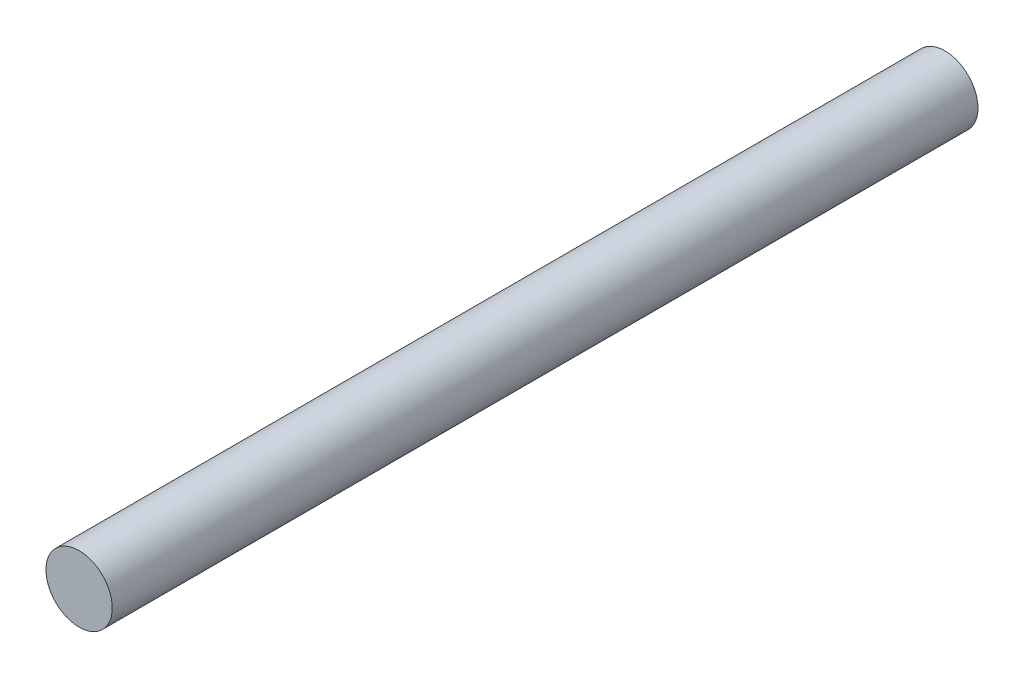
ISO-10303-21;
HEADER;
FILE_DESCRIPTION(('STEP AP214'),'2;1');
FILE_NAME('part.step','',(''),(''),'','','');
FILE_SCHEMA(('AUTOMOTIVE_DESIGN { 1 0 10303 214 1 1 1 1 }'));
ENDSEC;
DATA;
#1=APPLICATION_CONTEXT('core data for automotive mechanical design processes');
#2=APPLICATION_PROTOCOL_DEFINITION('international standard','automotive_design',2000,#1);
#3=PRODUCT_CONTEXT('',#1,'mechanical');
#4=PRODUCT('Part','Part','',(#3));
#5=PRODUCT_RELATED_PRODUCT_CATEGORY('part','',(#4));
#6=PRODUCT_DEFINITION_FORMATION('','',#4);
#7=PRODUCT_DEFINITION_CONTEXT('part definition',#1,'design');
#8=PRODUCT_DEFINITION('design','',#6,#7);
#9=PRODUCT_DEFINITION_SHAPE('','',#8);
#10=(LENGTH_UNIT() NAMED_UNIT(*) SI_UNIT(.MILLI.,.METRE.));
#11=(NAMED_UNIT(*) PLANE_ANGLE_UNIT() SI_UNIT($,.RADIAN.));
#12=(NAMED_UNIT(*) SI_UNIT($,.STERADIAN.) SOLID_ANGLE_UNIT());
#13=UNCERTAINTY_MEASURE_WITH_UNIT(LENGTH_MEASURE(1.E-05),#10,'distance_accuracy_value','');
#14=(GEOMETRIC_REPRESENTATION_CONTEXT(3) GLOBAL_UNCERTAINTY_ASSIGNED_CONTEXT((#13)) GLOBAL_UNIT_ASSIGNED_CONTEXT((#10,
#11,#12)) REPRESENTATION_CONTEXT('',''));
#15=CARTESIAN_POINT('',(0.,0.,0.));
#16=DIRECTION('',(0.,0.,1.));
#17=DIRECTION('',(1.,0.,0.));
#18=AXIS2_PLACEMENT_3D('',#15,#16,#17);
#19=CARTESIAN_POINT('',(-63.0236139140085,18.9324969217485,47.));
#20=DIRECTION('',(0.,0.,-1.));
#21=DIRECTION('',(-1.,0.,0.));
#22=AXIS2_PLACEMENT_3D('',#19,#20,#21);
#23=CYLINDRICAL_SURFACE('',#22,1.8);
#24=CARTESIAN_POINT('',(-63.0236139140085,18.9324969217485,47.));
#25=DIRECTION('',(0.,0.,1.));
#26=DIRECTION('',(1.,0.,0.));
#27=AXIS2_PLACEMENT_3D('',#24,#25,#26);
#28=CIRCLE('',#27,1.8);
#29=CARTESIAN_POINT('',(-61.2236139140085,18.9324969217485,47.));
#30=VERTEX_POINT('',#29);
#31=EDGE_CURVE('E10',#30,#30,#28,.T.);
#32=ORIENTED_EDGE('',*,*,#31,.F.);
#33=EDGE_LOOP('',(#32));
#34=FACE_BOUND('',#33,.T.);
#35=CARTESIAN_POINT('',(-63.0236139140085,18.9324969217485,0.));
#36=DIRECTION('',(0.,0.,1.));
#37=DIRECTION('',(1.,0.,0.));
#38=AXIS2_PLACEMENT_3D('',#35,#36,#37);
#39=CIRCLE('',#38,1.8);
#40=CARTESIAN_POINT('',(-61.2236139140085,18.9324969217485,0.));
#41=VERTEX_POINT('',#40);
#42=EDGE_CURVE('E40',#41,#41,#39,.T.);
#43=ORIENTED_EDGE('',*,*,#42,.T.);
#44=EDGE_LOOP('',(#43));
#45=FACE_BOUND('',#44,.T.);
#46=ADVANCED_FACE('F37',(#34,#45),#23,.T.);
#47=CARTESIAN_POINT('',(-63.0236139140085,18.9324969217485,47.));
#48=DIRECTION('',(0.,0.,1.));
#49=DIRECTION('',(1.,0.,0.));
#50=AXIS2_PLACEMENT_3D('',#47,#48,#49);
#51=PLANE('',#50);
#52=ORIENTED_EDGE('',*,*,#31,.T.);
#53=EDGE_LOOP('',(#52));
#54=FACE_BOUND('',#53,.T.);
#55=ADVANCED_FACE('F52',(#54),#51,.T.);
#56=CARTESIAN_POINT('',(-63.0236139140085,18.9324969217485,0.));
#57=DIRECTION('',(0.,0.,1.));
#58=DIRECTION('',(1.,0.,0.));
#59=AXIS2_PLACEMENT_3D('',#56,#57,#58);
#60=PLANE('',#59);
#61=ORIENTED_EDGE('',*,*,#42,.F.);
#62=EDGE_LOOP('',(#61));
#63=FACE_BOUND('',#62,.T.);
#64=ADVANCED_FACE('F50',(#63),#60,.F.);
#65=CLOSED_SHELL('',(#46,#55,#64));
#66=MANIFOLD_SOLID_BREP('B2',#65);
#67=ADVANCED_BREP_SHAPE_REPRESENTATION('',(#18,#66),#14);
#68=SHAPE_DEFINITION_REPRESENTATION(#9,#67);
ENDSEC;
END-ISO-10303-21;
